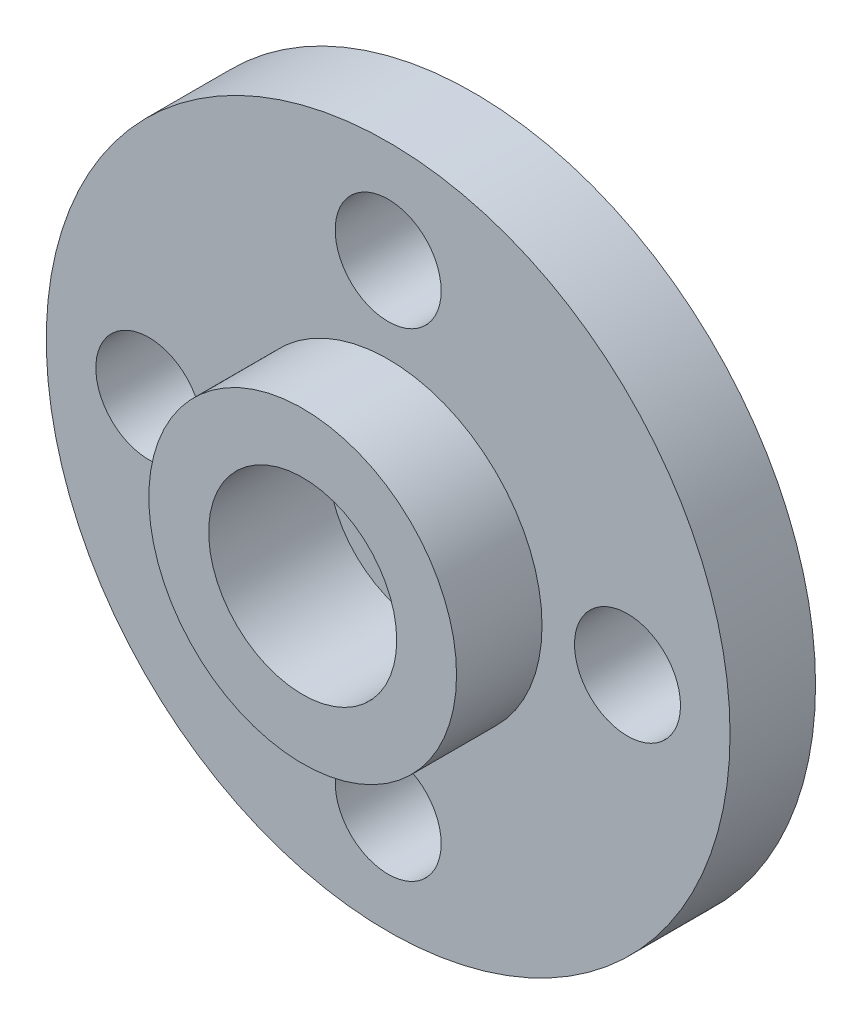
ISO-10303-21;
HEADER;
FILE_DESCRIPTION(('STEP AP214'),'2;1');
FILE_NAME('part.step','',(''),(''),'','','');
FILE_SCHEMA(('AUTOMOTIVE_DESIGN { 1 0 10303 214 1 1 1 1 }'));
ENDSEC;
DATA;
#1=APPLICATION_CONTEXT('core data for automotive mechanical design processes');
#2=APPLICATION_PROTOCOL_DEFINITION('international standard','automotive_design',2000,#1);
#3=PRODUCT_CONTEXT('',#1,'mechanical');
#4=PRODUCT('Part','Part','',(#3));
#5=PRODUCT_RELATED_PRODUCT_CATEGORY('part','',(#4));
#6=PRODUCT_DEFINITION_FORMATION('','',#4);
#7=PRODUCT_DEFINITION_CONTEXT('part definition',#1,'design');
#8=PRODUCT_DEFINITION('design','',#6,#7);
#9=PRODUCT_DEFINITION_SHAPE('','',#8);
#10=(LENGTH_UNIT() NAMED_UNIT(*) SI_UNIT(.MILLI.,.METRE.));
#11=(NAMED_UNIT(*) PLANE_ANGLE_UNIT() SI_UNIT($,.RADIAN.));
#12=(NAMED_UNIT(*) SI_UNIT($,.STERADIAN.) SOLID_ANGLE_UNIT());
#13=UNCERTAINTY_MEASURE_WITH_UNIT(LENGTH_MEASURE(1.E-05),#10,'distance_accuracy_value','');
#14=(GEOMETRIC_REPRESENTATION_CONTEXT(3) GLOBAL_UNCERTAINTY_ASSIGNED_CONTEXT((#13)) GLOBAL_UNIT_ASSIGNED_CONTEXT((#10,
#11,#12)) REPRESENTATION_CONTEXT('',''));
#15=CARTESIAN_POINT('',(0.,0.,0.));
#16=DIRECTION('',(0.,0.,1.));
#17=DIRECTION('',(1.,0.,0.));
#18=AXIS2_PLACEMENT_3D('',#15,#16,#17);
#19=CARTESIAN_POINT('',(0.,0.,0.));
#20=DIRECTION('',(0.,0.,1.));
#21=DIRECTION('',(1.,0.,0.));
#22=AXIS2_PLACEMENT_3D('',#19,#20,#21);
#23=CYLINDRICAL_SURFACE('',#22,1.55);
#24=CARTESIAN_POINT('',(0.,0.,0.));
#25=DIRECTION('',(0.,0.,1.));
#26=DIRECTION('',(1.,0.,0.));
#27=AXIS2_PLACEMENT_3D('',#24,#25,#26);
#28=CIRCLE('',#27,1.55);
#29=CARTESIAN_POINT('',(1.55,0.,0.));
#30=VERTEX_POINT('',#29);
#31=EDGE_CURVE('E82',#30,#30,#28,.T.);
#32=ORIENTED_EDGE('',*,*,#31,.F.);
#33=EDGE_LOOP('',(#32));
#34=FACE_BOUND('',#33,.T.);
#35=CARTESIAN_POINT('',(0.,0.,1.5));
#36=DIRECTION('',(0.,0.,1.));
#37=DIRECTION('',(1.,0.,0.));
#38=AXIS2_PLACEMENT_3D('',#35,#36,#37);
#39=CIRCLE('',#38,1.55);
#40=CARTESIAN_POINT('',(1.55,0.,1.5));
#41=VERTEX_POINT('',#40);
#42=EDGE_CURVE('E51',#41,#41,#39,.F.);
#43=ORIENTED_EDGE('',*,*,#42,.F.);
#44=EDGE_LOOP('',(#43));
#45=FACE_BOUND('',#44,.T.);
#46=ADVANCED_FACE('F47',(#34,#45),#23,.F.);
#47=CARTESIAN_POINT('',(0.,0.,2.5));
#48=DIRECTION('',(0.,0.,-1.));
#49=DIRECTION('',(-1.,0.,0.));
#50=AXIS2_PLACEMENT_3D('',#47,#48,#49);
#51=CYLINDRICAL_SURFACE('',#50,10.);
#52=CARTESIAN_POINT('',(0.,0.,2.5));
#53=DIRECTION('',(0.,0.,1.));
#54=DIRECTION('',(1.,0.,0.));
#55=AXIS2_PLACEMENT_3D('',#52,#53,#54);
#56=CIRCLE('',#55,10.);
#57=CARTESIAN_POINT('',(10.,0.,2.5));
#58=VERTEX_POINT('',#57);
#59=EDGE_CURVE('E11',#58,#58,#56,.T.);
#60=ORIENTED_EDGE('',*,*,#59,.F.);
#61=EDGE_LOOP('',(#60));
#62=FACE_BOUND('',#61,.T.);
#63=CARTESIAN_POINT('',(0.,0.,0.));
#64=DIRECTION('',(0.,0.,1.));
#65=DIRECTION('',(1.,0.,0.));
#66=AXIS2_PLACEMENT_3D('',#63,#64,#65);
#67=CIRCLE('',#66,10.);
#68=CARTESIAN_POINT('',(10.,0.,0.));
#69=VERTEX_POINT('',#68);
#70=EDGE_CURVE('E55',#69,#69,#67,.T.);
#71=ORIENTED_EDGE('',*,*,#70,.T.);
#72=EDGE_LOOP('',(#71));
#73=FACE_BOUND('',#72,.T.);
#74=ADVANCED_FACE('F49',(#62,#73),#51,.T.);
#75=CARTESIAN_POINT('',(0.,0.,2.5));
#76=DIRECTION('',(0.,0.,1.));
#77=DIRECTION('',(1.,0.,0.));
#78=AXIS2_PLACEMENT_3D('',#75,#76,#77);
#79=PLANE('',#78);
#80=CARTESIAN_POINT('',(7.,0.,2.5));
#81=DIRECTION('',(0.,0.,1.));
#82=DIRECTION('',(1.,0.,0.));
#83=AXIS2_PLACEMENT_3D('',#80,#81,#82);
#84=CIRCLE('',#83,1.55);
#85=CARTESIAN_POINT('',(8.55,0.,2.5));
#86=VERTEX_POINT('',#85);
#87=EDGE_CURVE('E70',#86,#86,#84,.T.);
#88=ORIENTED_EDGE('',*,*,#87,.F.);
#89=EDGE_LOOP('',(#88));
#90=FACE_BOUND('',#89,.T.);
#91=CARTESIAN_POINT('',(0.,7.,2.5));
#92=DIRECTION('',(0.,0.,1.));
#93=DIRECTION('',(1.,0.,0.));
#94=AXIS2_PLACEMENT_3D('',#91,#92,#93);
#95=CIRCLE('',#94,1.55);
#96=CARTESIAN_POINT('',(1.55,7.,2.5));
#97=VERTEX_POINT('',#96);
#98=EDGE_CURVE('E73',#97,#97,#95,.T.);
#99=ORIENTED_EDGE('',*,*,#98,.F.);
#100=EDGE_LOOP('',(#99));
#101=FACE_BOUND('',#100,.T.);
#102=CARTESIAN_POINT('',(-7.,0.,2.5));
#103=DIRECTION('',(0.,0.,1.));
#104=DIRECTION('',(1.,0.,0.));
#105=AXIS2_PLACEMENT_3D('',#102,#103,#104);
#106=CIRCLE('',#105,1.55);
#107=CARTESIAN_POINT('',(-5.45,0.,2.5));
#108=VERTEX_POINT('',#107);
#109=EDGE_CURVE('E76',#108,#108,#106,.T.);
#110=ORIENTED_EDGE('',*,*,#109,.F.);
#111=EDGE_LOOP('',(#110));
#112=FACE_BOUND('',#111,.T.);
#113=CARTESIAN_POINT('',(0.,-7.,2.5));
#114=DIRECTION('',(0.,0.,1.));
#115=DIRECTION('',(1.,0.,0.));
#116=AXIS2_PLACEMENT_3D('',#113,#114,#115);
#117=CIRCLE('',#116,1.55);
#118=CARTESIAN_POINT('',(1.55,-7.,2.5));
#119=VERTEX_POINT('',#118);
#120=EDGE_CURVE('E79',#119,#119,#117,.T.);
#121=ORIENTED_EDGE('',*,*,#120,.F.);
#122=EDGE_LOOP('',(#121));
#123=FACE_BOUND('',#122,.T.);
#124=CARTESIAN_POINT('',(0.,0.,2.5));
#125=DIRECTION('',(0.,0.,1.));
#126=DIRECTION('',(1.,0.,0.));
#127=AXIS2_PLACEMENT_3D('',#124,#125,#126);
#128=CIRCLE('',#127,4.5);
#129=CARTESIAN_POINT('',(4.5,0.,2.5));
#130=VERTEX_POINT('',#129);
#131=EDGE_CURVE('E62',#130,#130,#128,.T.);
#132=ORIENTED_EDGE('',*,*,#131,.F.);
#133=EDGE_LOOP('',(#132));
#134=FACE_BOUND('',#133,.T.);
#135=ORIENTED_EDGE('',*,*,#59,.T.);
#136=EDGE_LOOP('',(#135));
#137=FACE_BOUND('',#136,.T.);
#138=ADVANCED_FACE('F114',(#90,#101,#112,#123,#134,#137),#79,.T.);
#139=CARTESIAN_POINT('',(0.,0.,0.));
#140=DIRECTION('',(0.,0.,1.));
#141=DIRECTION('',(1.,0.,0.));
#142=AXIS2_PLACEMENT_3D('',#139,#140,#141);
#143=PLANE('',#142);
#144=CARTESIAN_POINT('',(7.,0.,0.));
#145=DIRECTION('',(0.,0.,1.));
#146=DIRECTION('',(1.,0.,0.));
#147=AXIS2_PLACEMENT_3D('',#144,#145,#146);
#148=CIRCLE('',#147,1.55);
#149=CARTESIAN_POINT('',(8.55,0.,0.));
#150=VERTEX_POINT('',#149);
#151=EDGE_CURVE('E85',#150,#150,#148,.T.);
#152=ORIENTED_EDGE('',*,*,#151,.T.);
#153=EDGE_LOOP('',(#152));
#154=FACE_BOUND('',#153,.T.);
#155=CARTESIAN_POINT('',(0.,7.,0.));
#156=DIRECTION('',(0.,0.,1.));
#157=DIRECTION('',(1.,0.,0.));
#158=AXIS2_PLACEMENT_3D('',#155,#156,#157);
#159=CIRCLE('',#158,1.55);
#160=CARTESIAN_POINT('',(1.55,7.,0.));
#161=VERTEX_POINT('',#160);
#162=EDGE_CURVE('E86',#161,#161,#159,.T.);
#163=ORIENTED_EDGE('',*,*,#162,.T.);
#164=EDGE_LOOP('',(#163));
#165=FACE_BOUND('',#164,.T.);
#166=CARTESIAN_POINT('',(-7.,0.,0.));
#167=DIRECTION('',(0.,0.,1.));
#168=DIRECTION('',(1.,0.,0.));
#169=AXIS2_PLACEMENT_3D('',#166,#167,#168);
#170=CIRCLE('',#169,1.55);
#171=CARTESIAN_POINT('',(-5.45,0.,0.));
#172=VERTEX_POINT('',#171);
#173=EDGE_CURVE('E89',#172,#172,#170,.T.);
#174=ORIENTED_EDGE('',*,*,#173,.T.);
#175=EDGE_LOOP('',(#174));
#176=FACE_BOUND('',#175,.T.);
#177=CARTESIAN_POINT('',(0.,-7.,0.));
#178=DIRECTION('',(0.,0.,1.));
#179=DIRECTION('',(1.,0.,0.));
#180=AXIS2_PLACEMENT_3D('',#177,#178,#179);
#181=CIRCLE('',#180,1.55);
#182=CARTESIAN_POINT('',(1.55,-7.,0.));
#183=VERTEX_POINT('',#182);
#184=EDGE_CURVE('E92',#183,#183,#181,.T.);
#185=ORIENTED_EDGE('',*,*,#184,.T.);
#186=EDGE_LOOP('',(#185));
#187=FACE_BOUND('',#186,.T.);
#188=ORIENTED_EDGE('',*,*,#31,.T.);
#189=EDGE_LOOP('',(#188));
#190=FACE_BOUND('',#189,.T.);
#191=ORIENTED_EDGE('',*,*,#70,.F.);
#192=EDGE_LOOP('',(#191));
#193=FACE_BOUND('',#192,.T.);
#194=ADVANCED_FACE('F129',(#154,#165,#176,#187,#190,#193),#143,.F.);
#195=CARTESIAN_POINT('',(0.,0.,5.));
#196=DIRECTION('',(0.,0.,1.));
#197=DIRECTION('',(1.,0.,0.));
#198=AXIS2_PLACEMENT_3D('',#195,#196,#197);
#199=PLANE('',#198);
#200=CARTESIAN_POINT('',(0.,0.,5.));
#201=DIRECTION('',(0.,0.,1.));
#202=DIRECTION('',(1.,0.,0.));
#203=AXIS2_PLACEMENT_3D('',#200,#201,#202);
#204=CIRCLE('',#203,4.5);
#205=CARTESIAN_POINT('',(4.5,0.,5.));
#206=VERTEX_POINT('',#205);
#207=EDGE_CURVE('E60',#206,#206,#204,.T.);
#208=ORIENTED_EDGE('',*,*,#207,.T.);
#209=EDGE_LOOP('',(#208));
#210=FACE_BOUND('',#209,.T.);
#211=CARTESIAN_POINT('',(0.,0.,5.));
#212=DIRECTION('',(0.,0.,1.));
#213=DIRECTION('',(1.,0.,0.));
#214=AXIS2_PLACEMENT_3D('',#211,#212,#213);
#215=CIRCLE('',#214,2.75);
#216=CARTESIAN_POINT('',(2.75,0.,5.));
#217=VERTEX_POINT('',#216);
#218=EDGE_CURVE('E65',#217,#217,#215,.T.);
#219=ORIENTED_EDGE('',*,*,#218,.F.);
#220=EDGE_LOOP('',(#219));
#221=FACE_BOUND('',#220,.T.);
#222=ADVANCED_FACE('F126',(#210,#221),#199,.T.);
#223=CARTESIAN_POINT('',(0.,0.,5.));
#224=DIRECTION('',(0.,0.,-1.));
#225=DIRECTION('',(-1.,0.,0.));
#226=AXIS2_PLACEMENT_3D('',#223,#224,#225);
#227=CYLINDRICAL_SURFACE('',#226,4.5);
#228=ORIENTED_EDGE('',*,*,#207,.F.);
#229=EDGE_LOOP('',(#228));
#230=FACE_BOUND('',#229,.T.);
#231=ORIENTED_EDGE('',*,*,#131,.T.);
#232=EDGE_LOOP('',(#231));
#233=FACE_BOUND('',#232,.T.);
#234=ADVANCED_FACE('F124',(#230,#233),#227,.T.);
#235=CARTESIAN_POINT('',(0.,0.,5.));
#236=DIRECTION('',(0.,0.,-1.));
#237=DIRECTION('',(-1.,0.,0.));
#238=AXIS2_PLACEMENT_3D('',#235,#236,#237);
#239=CYLINDRICAL_SURFACE('',#238,2.75);
#240=ORIENTED_EDGE('',*,*,#218,.T.);
#241=EDGE_LOOP('',(#240));
#242=FACE_BOUND('',#241,.T.);
#243=CARTESIAN_POINT('',(0.,0.,1.5));
#244=DIRECTION('',(0.,0.,1.));
#245=DIRECTION('',(1.,0.,0.));
#246=AXIS2_PLACEMENT_3D('',#243,#244,#245);
#247=CIRCLE('',#246,2.75);
#248=CARTESIAN_POINT('',(2.75,0.,1.5));
#249=VERTEX_POINT('',#248);
#250=EDGE_CURVE('E97',#249,#249,#247,.T.);
#251=ORIENTED_EDGE('',*,*,#250,.F.);
#252=EDGE_LOOP('',(#251));
#253=FACE_BOUND('',#252,.T.);
#254=ADVANCED_FACE('F121',(#242,#253),#239,.F.);
#255=CARTESIAN_POINT('',(0.,-7.,0.));
#256=DIRECTION('',(0.,0.,1.));
#257=DIRECTION('',(1.,0.,0.));
#258=AXIS2_PLACEMENT_3D('',#255,#256,#257);
#259=CYLINDRICAL_SURFACE('',#258,1.55);
#260=ORIENTED_EDGE('',*,*,#120,.T.);
#261=EDGE_LOOP('',(#260));
#262=FACE_BOUND('',#261,.T.);
#263=ORIENTED_EDGE('',*,*,#184,.F.);
#264=EDGE_LOOP('',(#263));
#265=FACE_BOUND('',#264,.T.);
#266=ADVANCED_FACE('F123',(#262,#265),#259,.F.);
#267=CARTESIAN_POINT('',(-7.,0.,0.));
#268=DIRECTION('',(0.,0.,1.));
#269=DIRECTION('',(1.,0.,0.));
#270=AXIS2_PLACEMENT_3D('',#267,#268,#269);
#271=CYLINDRICAL_SURFACE('',#270,1.55);
#272=ORIENTED_EDGE('',*,*,#109,.T.);
#273=EDGE_LOOP('',(#272));
#274=FACE_BOUND('',#273,.T.);
#275=ORIENTED_EDGE('',*,*,#173,.F.);
#276=EDGE_LOOP('',(#275));
#277=FACE_BOUND('',#276,.T.);
#278=ADVANCED_FACE('F153',(#274,#277),#271,.F.);
#279=CARTESIAN_POINT('',(0.,7.,0.));
#280=DIRECTION('',(0.,0.,1.));
#281=DIRECTION('',(1.,0.,0.));
#282=AXIS2_PLACEMENT_3D('',#279,#280,#281);
#283=CYLINDRICAL_SURFACE('',#282,1.55);
#284=ORIENTED_EDGE('',*,*,#98,.T.);
#285=EDGE_LOOP('',(#284));
#286=FACE_BOUND('',#285,.T.);
#287=ORIENTED_EDGE('',*,*,#162,.F.);
#288=EDGE_LOOP('',(#287));
#289=FACE_BOUND('',#288,.T.);
#290=ADVANCED_FACE('F119',(#286,#289),#283,.F.);
#291=CARTESIAN_POINT('',(7.,0.,0.));
#292=DIRECTION('',(0.,0.,1.));
#293=DIRECTION('',(1.,0.,0.));
#294=AXIS2_PLACEMENT_3D('',#291,#292,#293);
#295=CYLINDRICAL_SURFACE('',#294,1.55);
#296=ORIENTED_EDGE('',*,*,#87,.T.);
#297=EDGE_LOOP('',(#296));
#298=FACE_BOUND('',#297,.T.);
#299=ORIENTED_EDGE('',*,*,#151,.F.);
#300=EDGE_LOOP('',(#299));
#301=FACE_BOUND('',#300,.T.);
#302=ADVANCED_FACE('F162',(#298,#301),#295,.F.);
#303=CARTESIAN_POINT('',(0.,0.,1.5));
#304=DIRECTION('',(0.,0.,1.));
#305=DIRECTION('',(1.,0.,0.));
#306=AXIS2_PLACEMENT_3D('',#303,#304,#305);
#307=PLANE('',#306);
#308=ORIENTED_EDGE('',*,*,#250,.T.);
#309=EDGE_LOOP('',(#308));
#310=FACE_BOUND('',#309,.T.);
#311=ORIENTED_EDGE('',*,*,#42,.T.);
#312=EDGE_LOOP('',(#311));
#313=FACE_BOUND('',#312,.T.);
#314=ADVANCED_FACE('F104',(#310,#313),#307,.T.);
#315=CLOSED_SHELL('',(#46,#74,#138,#194,#222,#234,#254,#266,#278,#290,#302,#314));
#316=MANIFOLD_SOLID_BREP('B2',#315);
#317=ADVANCED_BREP_SHAPE_REPRESENTATION('',(#18,#316),#14);
#318=SHAPE_DEFINITION_REPRESENTATION(#9,#317);
ENDSEC;
END-ISO-10303-21;
